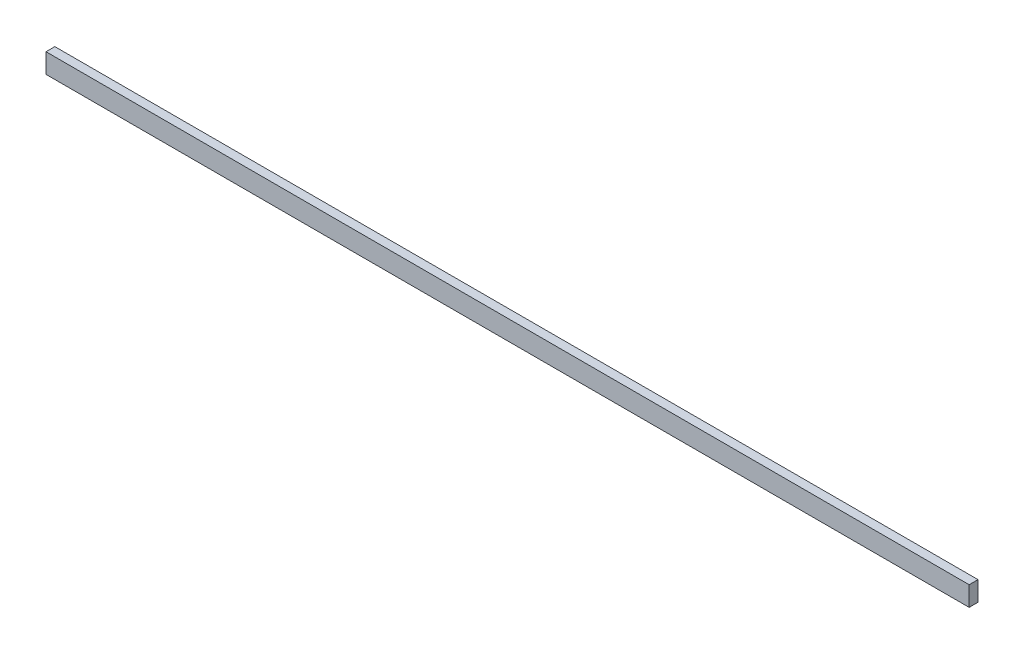
ISO-10303-21;
HEADER;
FILE_DESCRIPTION(('STEP AP214'),'2;1');
FILE_NAME('part.step','',(''),(''),'','','');
FILE_SCHEMA(('AUTOMOTIVE_DESIGN { 1 0 10303 214 1 1 1 1 }'));
ENDSEC;
DATA;
#1=APPLICATION_CONTEXT('core data for automotive mechanical design processes');
#2=APPLICATION_PROTOCOL_DEFINITION('international standard','automotive_design',2000,#1);
#3=PRODUCT_CONTEXT('',#1,'mechanical');
#4=PRODUCT('Part','Part','',(#3));
#5=PRODUCT_RELATED_PRODUCT_CATEGORY('part','',(#4));
#6=PRODUCT_DEFINITION_FORMATION('','',#4);
#7=PRODUCT_DEFINITION_CONTEXT('part definition',#1,'design');
#8=PRODUCT_DEFINITION('design','',#6,#7);
#9=PRODUCT_DEFINITION_SHAPE('','',#8);
#10=(LENGTH_UNIT() NAMED_UNIT(*) SI_UNIT(.MILLI.,.METRE.));
#11=(NAMED_UNIT(*) PLANE_ANGLE_UNIT() SI_UNIT($,.RADIAN.));
#12=(NAMED_UNIT(*) SI_UNIT($,.STERADIAN.) SOLID_ANGLE_UNIT());
#13=UNCERTAINTY_MEASURE_WITH_UNIT(LENGTH_MEASURE(1.E-05),#10,'distance_accuracy_value','');
#14=(GEOMETRIC_REPRESENTATION_CONTEXT(3) GLOBAL_UNCERTAINTY_ASSIGNED_CONTEXT((#13)) GLOBAL_UNIT_ASSIGNED_CONTEXT((#10,
#11,#12)) REPRESENTATION_CONTEXT('',''));
#15=CARTESIAN_POINT('',(0.,0.,0.));
#16=DIRECTION('',(0.,0.,1.));
#17=DIRECTION('',(1.,0.,0.));
#18=AXIS2_PLACEMENT_3D('',#15,#16,#17);
#19=CARTESIAN_POINT('',(939.999999999998,-20.,-8.));
#20=DIRECTION('',(1.,0.,0.));
#21=DIRECTION('',(0.,0.,-1.));
#22=AXIS2_PLACEMENT_3D('',#19,#20,#21);
#23=PLANE('',#22);
#24=DIRECTION('',(0.,0.,1.));
#25=VECTOR('',#24,1.);
#26=CARTESIAN_POINT('',(939.999999999998,20.,-8.));
#27=LINE('',#26,#25);
#28=CARTESIAN_POINT('',(939.999999999998,20.,-8.));
#29=VERTEX_POINT('',#28);
#30=CARTESIAN_POINT('',(939.999999999998,20.,10.));
#31=VERTEX_POINT('',#30);
#32=EDGE_CURVE('E38',#29,#31,#27,.T.);
#33=ORIENTED_EDGE('',*,*,#32,.T.);
#34=DIRECTION('',(0.,1.,0.));
#35=VECTOR('',#34,1.);
#36=CARTESIAN_POINT('',(939.999999999998,-20.,10.));
#37=LINE('',#36,#35);
#38=CARTESIAN_POINT('',(939.999999999998,-20.,10.));
#39=VERTEX_POINT('',#38);
#40=EDGE_CURVE('E75',#39,#31,#37,.T.);
#41=ORIENTED_EDGE('',*,*,#40,.F.);
#42=DIRECTION('',(0.,0.,1.));
#43=VECTOR('',#42,1.);
#44=CARTESIAN_POINT('',(939.999999999998,-20.,-8.));
#45=LINE('',#44,#43);
#46=CARTESIAN_POINT('',(939.999999999998,-20.,-8.));
#47=VERTEX_POINT('',#46);
#48=EDGE_CURVE('E11',#47,#39,#45,.T.);
#49=ORIENTED_EDGE('',*,*,#48,.F.);
#50=DIRECTION('',(0.,1.,0.));
#51=VECTOR('',#50,1.);
#52=CARTESIAN_POINT('',(939.999999999998,-20.,-8.));
#53=LINE('',#52,#51);
#54=EDGE_CURVE('E76',#47,#29,#53,.T.);
#55=ORIENTED_EDGE('',*,*,#54,.T.);
#56=EDGE_LOOP('',(#33,#41,#49,#55));
#57=FACE_BOUND('',#56,.T.);
#58=ADVANCED_FACE('F35',(#57),#23,.T.);
#59=CARTESIAN_POINT('',(-940.000000000003,-20.,-8.));
#60=DIRECTION('',(0.,-1.,0.));
#61=DIRECTION('',(0.,0.,-1.));
#62=AXIS2_PLACEMENT_3D('',#59,#60,#61);
#63=PLANE('',#62);
#64=ORIENTED_EDGE('',*,*,#48,.T.);
#65=DIRECTION('',(1.,0.,0.));
#66=VECTOR('',#65,1.);
#67=CARTESIAN_POINT('',(-940.000000000003,-20.,10.));
#68=LINE('',#67,#66);
#69=CARTESIAN_POINT('',(-940.000000000003,-20.,10.));
#70=VERTEX_POINT('',#69);
#71=EDGE_CURVE('E92',#70,#39,#68,.T.);
#72=ORIENTED_EDGE('',*,*,#71,.F.);
#73=DIRECTION('',(0.,0.,1.));
#74=VECTOR('',#73,1.);
#75=CARTESIAN_POINT('',(-940.000000000003,-20.,-8.));
#76=LINE('',#75,#74);
#77=CARTESIAN_POINT('',(-940.000000000003,-20.,-8.));
#78=VERTEX_POINT('',#77);
#79=EDGE_CURVE('E43',#78,#70,#76,.T.);
#80=ORIENTED_EDGE('',*,*,#79,.F.);
#81=DIRECTION('',(1.,0.,0.));
#82=VECTOR('',#81,1.);
#83=CARTESIAN_POINT('',(-940.000000000003,-20.,-8.));
#84=LINE('',#83,#82);
#85=EDGE_CURVE('E81',#78,#47,#84,.T.);
#86=ORIENTED_EDGE('',*,*,#85,.T.);
#87=EDGE_LOOP('',(#64,#72,#80,#86));
#88=FACE_BOUND('',#87,.T.);
#89=ADVANCED_FACE('F107',(#88),#63,.T.);
#90=CARTESIAN_POINT('',(-940.000000000003,-20.,-8.));
#91=DIRECTION('',(-1.,0.,0.));
#92=DIRECTION('',(0.,0.,1.));
#93=AXIS2_PLACEMENT_3D('',#90,#91,#92);
#94=PLANE('',#93);
#95=ORIENTED_EDGE('',*,*,#79,.T.);
#96=DIRECTION('',(0.,-1.,0.));
#97=VECTOR('',#96,1.);
#98=CARTESIAN_POINT('',(-940.000000000003,-20.,10.));
#99=LINE('',#98,#97);
#100=CARTESIAN_POINT('',(-940.000000000003,20.,10.));
#101=VERTEX_POINT('',#100);
#102=EDGE_CURVE('E88',#101,#70,#99,.T.);
#103=ORIENTED_EDGE('',*,*,#102,.F.);
#104=DIRECTION('',(0.,0.,1.));
#105=VECTOR('',#104,1.);
#106=CARTESIAN_POINT('',(-940.000000000003,20.,-8.));
#107=LINE('',#106,#105);
#108=CARTESIAN_POINT('',(-940.000000000003,20.,-8.));
#109=VERTEX_POINT('',#108);
#110=EDGE_CURVE('E80',#109,#101,#107,.T.);
#111=ORIENTED_EDGE('',*,*,#110,.F.);
#112=DIRECTION('',(0.,-1.,0.));
#113=VECTOR('',#112,1.);
#114=CARTESIAN_POINT('',(-940.000000000003,-20.,-8.));
#115=LINE('',#114,#113);
#116=EDGE_CURVE('E100',#109,#78,#115,.T.);
#117=ORIENTED_EDGE('',*,*,#116,.T.);
#118=EDGE_LOOP('',(#95,#103,#111,#117));
#119=FACE_BOUND('',#118,.T.);
#120=ADVANCED_FACE('F104',(#119),#94,.T.);
#121=CARTESIAN_POINT('',(-940.000000000003,20.,-8.));
#122=DIRECTION('',(0.,1.,0.));
#123=DIRECTION('',(0.,0.,1.));
#124=AXIS2_PLACEMENT_3D('',#121,#122,#123);
#125=PLANE('',#124);
#126=ORIENTED_EDGE('',*,*,#110,.T.);
#127=DIRECTION('',(-1.,0.,0.));
#128=VECTOR('',#127,1.);
#129=CARTESIAN_POINT('',(-940.000000000003,20.,10.));
#130=LINE('',#129,#128);
#131=EDGE_CURVE('E83',#31,#101,#130,.T.);
#132=ORIENTED_EDGE('',*,*,#131,.F.);
#133=ORIENTED_EDGE('',*,*,#32,.F.);
#134=DIRECTION('',(-1.,0.,0.));
#135=VECTOR('',#134,1.);
#136=CARTESIAN_POINT('',(-940.000000000003,20.,-8.));
#137=LINE('',#136,#135);
#138=EDGE_CURVE('E98',#29,#109,#137,.T.);
#139=ORIENTED_EDGE('',*,*,#138,.T.);
#140=EDGE_LOOP('',(#126,#132,#133,#139));
#141=FACE_BOUND('',#140,.T.);
#142=ADVANCED_FACE('F84',(#141),#125,.T.);
#143=CARTESIAN_POINT('',(0.,0.,-8.));
#144=DIRECTION('',(0.,0.,-1.));
#145=DIRECTION('',(-1.,0.,0.));
#146=AXIS2_PLACEMENT_3D('',#143,#144,#145);
#147=PLANE('',#146);
#148=ORIENTED_EDGE('',*,*,#54,.F.);
#149=ORIENTED_EDGE('',*,*,#85,.F.);
#150=ORIENTED_EDGE('',*,*,#116,.F.);
#151=ORIENTED_EDGE('',*,*,#138,.F.);
#152=EDGE_LOOP('',(#148,#149,#150,#151));
#153=FACE_BOUND('',#152,.T.);
#154=ADVANCED_FACE('F109',(#153),#147,.T.);
#155=CARTESIAN_POINT('',(0.,0.,10.));
#156=DIRECTION('',(0.,0.,-1.));
#157=DIRECTION('',(-1.,0.,0.));
#158=AXIS2_PLACEMENT_3D('',#155,#156,#157);
#159=PLANE('',#158);
#160=ORIENTED_EDGE('',*,*,#40,.T.);
#161=ORIENTED_EDGE('',*,*,#131,.T.);
#162=ORIENTED_EDGE('',*,*,#102,.T.);
#163=ORIENTED_EDGE('',*,*,#71,.T.);
#164=EDGE_LOOP('',(#160,#161,#162,#163));
#165=FACE_BOUND('',#164,.T.);
#166=ADVANCED_FACE('F91',(#165),#159,.F.);
#167=CLOSED_SHELL('',(#58,#89,#120,#142,#154,#166));
#168=MANIFOLD_SOLID_BREP('B2',#167);
#169=ADVANCED_BREP_SHAPE_REPRESENTATION('',(#18,#168),#14);
#170=SHAPE_DEFINITION_REPRESENTATION(#9,#169);
ENDSEC;
END-ISO-10303-21;
